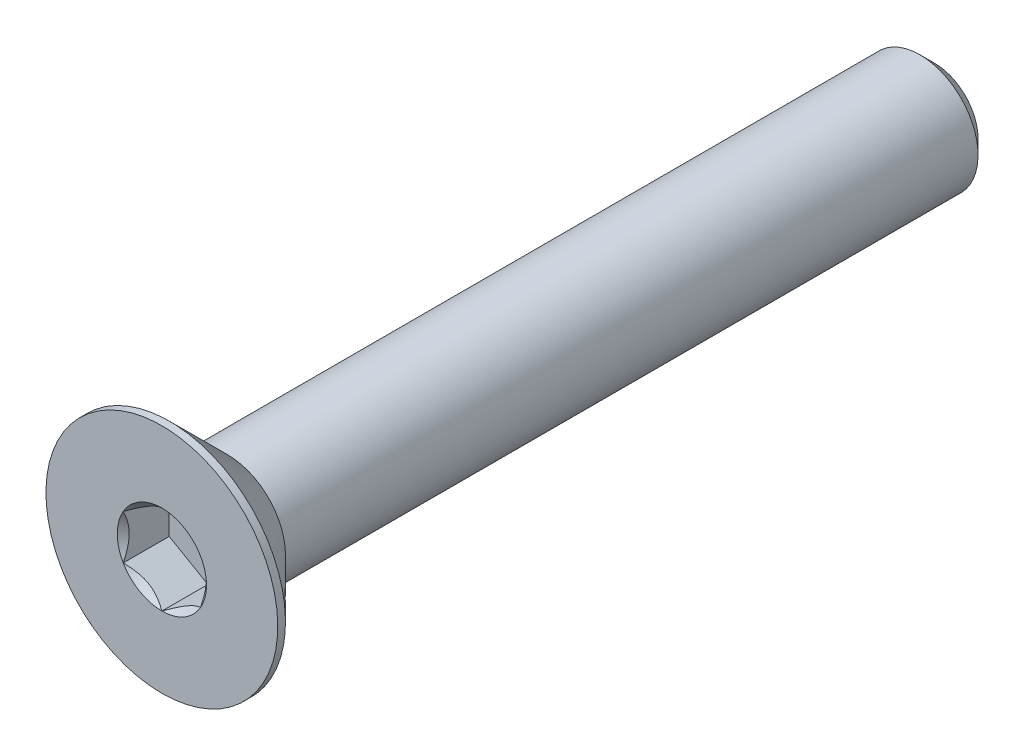
ISO-10303-21;
HEADER;
FILE_DESCRIPTION(('STEP AP214'),'2;1');
FILE_NAME('part.step','',(''),(''),'','','');
FILE_SCHEMA(('AUTOMOTIVE_DESIGN { 1 0 10303 214 1 1 1 1 }'));
ENDSEC;
DATA;
#1=APPLICATION_CONTEXT('core data for automotive mechanical design processes');
#2=APPLICATION_PROTOCOL_DEFINITION('international standard','automotive_design',2000,#1);
#3=PRODUCT_CONTEXT('',#1,'mechanical');
#4=PRODUCT('Part','Part','',(#3));
#5=PRODUCT_RELATED_PRODUCT_CATEGORY('part','',(#4));
#6=PRODUCT_DEFINITION_FORMATION('','',#4);
#7=PRODUCT_DEFINITION_CONTEXT('part definition',#1,'design');
#8=PRODUCT_DEFINITION('design','',#6,#7);
#9=PRODUCT_DEFINITION_SHAPE('','',#8);
#10=(LENGTH_UNIT() NAMED_UNIT(*) SI_UNIT(.MILLI.,.METRE.));
#11=(NAMED_UNIT(*) PLANE_ANGLE_UNIT() SI_UNIT($,.RADIAN.));
#12=(NAMED_UNIT(*) SI_UNIT($,.STERADIAN.) SOLID_ANGLE_UNIT());
#13=UNCERTAINTY_MEASURE_WITH_UNIT(LENGTH_MEASURE(1.E-05),#10,'distance_accuracy_value','');
#14=(GEOMETRIC_REPRESENTATION_CONTEXT(3) GLOBAL_UNCERTAINTY_ASSIGNED_CONTEXT((#13)) GLOBAL_UNIT_ASSIGNED_CONTEXT((#10,
#11,#12)) REPRESENTATION_CONTEXT('',''));
#15=CARTESIAN_POINT('',(0.,0.,0.));
#16=DIRECTION('',(0.,0.,1.));
#17=DIRECTION('',(1.,0.,0.));
#18=AXIS2_PLACEMENT_3D('',#15,#16,#17);
#19=CARTESIAN_POINT('',(0.,0.,-20.));
#20=DIRECTION('',(0.,0.,-1.));
#21=DIRECTION('',(0.,1.,0.));
#22=AXIS2_PLACEMENT_3D('',#19,#20,#21);
#23=CYLINDRICAL_SURFACE('',#22,1.5);
#24=CARTESIAN_POINT('',(0.,0.,-19.625));
#25=DIRECTION('',(0.,0.,-1.));
#26=DIRECTION('',(0.,1.,0.));
#27=AXIS2_PLACEMENT_3D('',#24,#25,#26);
#28=CIRCLE('',#27,1.5);
#29=CARTESIAN_POINT('',(0.,1.5,-19.625));
#30=VERTEX_POINT('',#29);
#31=EDGE_CURVE('E48',#30,#30,#28,.F.);
#32=ORIENTED_EDGE('',*,*,#31,.T.);
#33=EDGE_LOOP('',(#32));
#34=FACE_BOUND('',#33,.T.);
#35=CARTESIAN_POINT('',(0.,0.,-1.7));
#36=DIRECTION('',(0.,0.,1.));
#37=DIRECTION('',(0.,-1.,0.));
#38=AXIS2_PLACEMENT_3D('',#35,#36,#37);
#39=CIRCLE('',#38,1.5);
#40=CARTESIAN_POINT('',(0.,-1.50000000000001,-1.69999999999999));
#41=VERTEX_POINT('',#40);
#42=EDGE_CURVE('E166',#41,#41,#39,.T.);
#43=ORIENTED_EDGE('',*,*,#42,.F.);
#44=EDGE_LOOP('',(#43));
#45=FACE_BOUND('',#44,.T.);
#46=ADVANCED_FACE('F35',(#34,#45),#23,.T.);
#47=CARTESIAN_POINT('',(0.,-1.5,-20.));
#48=DIRECTION('',(0.,0.,-1.));
#49=DIRECTION('',(0.,1.,0.));
#50=AXIS2_PLACEMENT_3D('',#47,#48,#49);
#51=PLANE('',#50);
#52=CARTESIAN_POINT('',(0.,0.,-20.));
#53=DIRECTION('',(0.,0.,-1.));
#54=DIRECTION('',(0.,1.,0.));
#55=AXIS2_PLACEMENT_3D('',#52,#53,#54);
#56=CIRCLE('',#55,1.125);
#57=CARTESIAN_POINT('',(0.,1.125,-20.));
#58=VERTEX_POINT('',#57);
#59=EDGE_CURVE('E175',#58,#58,#56,.T.);
#60=ORIENTED_EDGE('',*,*,#59,.T.);
#61=EDGE_LOOP('',(#60));
#62=FACE_BOUND('',#61,.T.);
#63=ADVANCED_FACE('F185',(#62),#51,.T.);
#64=CARTESIAN_POINT('',(0.,0.,-20.));
#65=DIRECTION('',(0.,0.,1.));
#66=DIRECTION('',(0.,-1.,0.));
#67=AXIS2_PLACEMENT_3D('',#64,#65,#66);
#68=CONICAL_SURFACE('',#67,1.125,0.785398163397446);
#69=ORIENTED_EDGE('',*,*,#31,.F.);
#70=EDGE_LOOP('',(#69));
#71=FACE_BOUND('',#70,.T.);
#72=ORIENTED_EDGE('',*,*,#59,.F.);
#73=EDGE_LOOP('',(#72));
#74=FACE_BOUND('',#73,.T.);
#75=ADVANCED_FACE('F37',(#71,#74),#68,.T.);
#76=CARTESIAN_POINT('',(0.,0.,0.));
#77=DIRECTION('',(0.,0.,1.));
#78=DIRECTION('',(0.,-1.,0.));
#79=AXIS2_PLACEMENT_3D('',#76,#77,#78);
#80=CYLINDRICAL_SURFACE('',#79,3.);
#81=CARTESIAN_POINT('',(0.,0.,0.));
#82=DIRECTION('',(0.,0.,1.));
#83=DIRECTION('',(0.,-1.,0.));
#84=AXIS2_PLACEMENT_3D('',#81,#82,#83);
#85=CIRCLE('',#84,3.);
#86=CARTESIAN_POINT('',(0.,-3.,0.));
#87=VERTEX_POINT('',#86);
#88=EDGE_CURVE('E172',#87,#87,#85,.T.);
#89=ORIENTED_EDGE('',*,*,#88,.F.);
#90=EDGE_LOOP('',(#89));
#91=FACE_BOUND('',#90,.T.);
#92=CARTESIAN_POINT('',(0.,0.,-0.200000000000003));
#93=DIRECTION('',(0.,0.,1.));
#94=DIRECTION('',(0.,-1.,0.));
#95=AXIS2_PLACEMENT_3D('',#92,#93,#94);
#96=CIRCLE('',#95,3.);
#97=CARTESIAN_POINT('',(0.,-3.,-0.199999999999997));
#98=VERTEX_POINT('',#97);
#99=EDGE_CURVE('E169',#98,#98,#96,.T.);
#100=ORIENTED_EDGE('',*,*,#99,.T.);
#101=EDGE_LOOP('',(#100));
#102=FACE_BOUND('',#101,.T.);
#103=ADVANCED_FACE('F184',(#91,#102),#80,.T.);
#104=CARTESIAN_POINT('',(0.,0.,-1.7));
#105=DIRECTION('',(0.,0.,1.));
#106=DIRECTION('',(0.,-1.,0.));
#107=AXIS2_PLACEMENT_3D('',#104,#105,#106);
#108=CONICAL_SURFACE('',#107,1.5,0.785398163397448);
#109=ORIENTED_EDGE('',*,*,#99,.F.);
#110=EDGE_LOOP('',(#109));
#111=FACE_BOUND('',#110,.T.);
#112=ORIENTED_EDGE('',*,*,#42,.T.);
#113=EDGE_LOOP('',(#112));
#114=FACE_BOUND('',#113,.T.);
#115=ADVANCED_FACE('F195',(#111,#114),#108,.T.);
#116=CARTESIAN_POINT('',(0.,-1.5,0.));
#117=DIRECTION('',(0.,0.,1.));
#118=DIRECTION('',(0.,-1.,0.));
#119=AXIS2_PLACEMENT_3D('',#116,#117,#118);
#120=PLANE('',#119);
#121=CARTESIAN_POINT('',(0.,0.,0.));
#122=DIRECTION('',(0.,0.,1.));
#123=DIRECTION('',(1.,0.,0.));
#124=AXIS2_PLACEMENT_3D('',#121,#122,#123);
#125=CIRCLE('',#124,1.15470053837925);
#126=CARTESIAN_POINT('',(0.,-1.15470053837925,0.));
#127=VERTEX_POINT('',#126);
#128=CARTESIAN_POINT('',(1.,-0.577350269189629,0.));
#129=VERTEX_POINT('',#128);
#130=EDGE_CURVE('E94',#127,#129,#125,.T.);
#131=ORIENTED_EDGE('',*,*,#130,.F.);
#132=CARTESIAN_POINT('',(-1.,-0.577350269189625,0.));
#133=VERTEX_POINT('',#132);
#134=EDGE_CURVE('E54',#133,#127,#125,.T.);
#135=ORIENTED_EDGE('',*,*,#134,.F.);
#136=CARTESIAN_POINT('',(-1.,0.577350269189627,0.));
#137=VERTEX_POINT('',#136);
#138=EDGE_CURVE('E136',#137,#133,#125,.T.);
#139=ORIENTED_EDGE('',*,*,#138,.F.);
#140=CARTESIAN_POINT('',(0.,1.15470053837925,0.));
#141=VERTEX_POINT('',#140);
#142=EDGE_CURVE('E61',#141,#137,#125,.T.);
#143=ORIENTED_EDGE('',*,*,#142,.F.);
#144=CARTESIAN_POINT('',(0.999999999999999,0.57735026918963,0.));
#145=VERTEX_POINT('',#144);
#146=EDGE_CURVE('E130',#145,#141,#125,.T.);
#147=ORIENTED_EDGE('',*,*,#146,.F.);
#148=EDGE_CURVE('E102',#129,#145,#125,.T.);
#149=ORIENTED_EDGE('',*,*,#148,.F.);
#150=EDGE_LOOP('',(#131,#135,#139,#143,#147,#149));
#151=FACE_BOUND('',#150,.T.);
#152=ORIENTED_EDGE('',*,*,#88,.T.);
#153=EDGE_LOOP('',(#152));
#154=FACE_BOUND('',#153,.T.);
#155=ADVANCED_FACE('F128',(#151,#154),#120,.T.);
#156=CARTESIAN_POINT('',(0.,0.,0.));
#157=DIRECTION('',(0.,0.,1.));
#158=DIRECTION('',(1.,0.,0.));
#159=AXIS2_PLACEMENT_3D('',#156,#157,#158);
#160=CONICAL_SURFACE('',#159,1.15470053837925,0.78539816339745);
#161=ORIENTED_EDGE('',*,*,#148,.T.);
#162=CARTESIAN_POINT('',(1.,-1.15147208663215,0.37038567764035));
#163=CARTESIAN_POINT('',(1.,-1.12343448004835,0.349219919995329));
#164=CARTESIAN_POINT('',(1.,-1.09524064866509,0.328261692292662));
#165=CARTESIAN_POINT('',(1.,-1.0384771565924,0.286846022342674));
#166=CARTESIAN_POINT('',(1.,-1.00990740397363,0.266388706225875));
#167=CARTESIAN_POINT('',(1.,-0.923120894462775,0.205604795042125));
#168=CARTESIAN_POINT('',(1.,-0.864253173878445,0.166192229039321));
#169=CARTESIAN_POINT('',(1.,-0.740809858355811,0.0888206642581912));
#170=CARTESIAN_POINT('',(1.,-0.676100255223809,0.0510730391621572));
#171=CARTESIAN_POINT('',(1.,-0.543448939110598,-0.0179754124197493));
#172=CARTESIAN_POINT('',(1.,-0.475519112076496,-0.0492979721328732));
#173=CARTESIAN_POINT('',(1.,-0.373555850372648,-0.0876182211023994));
#174=CARTESIAN_POINT('',(1.,-0.341031989714046,-0.0986164083437858));
#175=CARTESIAN_POINT('',(1.,-0.275199079103602,-0.118001657838892));
#176=CARTESIAN_POINT('',(1.,-0.241889975229392,-0.126388540210114));
#177=CARTESIAN_POINT('',(1.,-0.175247517106615,-0.139974779269861));
#178=CARTESIAN_POINT('',(1.,-0.141925568285808,-0.145229209222388));
#179=CARTESIAN_POINT('',(1.,-0.0749144363078012,-0.152451313423326));
#180=CARTESIAN_POINT('',(1.,-0.0412251979295629,-0.154418486386096));
#181=CARTESIAN_POINT('',(1.,0.0249580991768641,-0.15491680160889));
#182=CARTESIAN_POINT('',(0.999999999999999,0.0574512825561956,-0.153569732116433));
#183=CARTESIAN_POINT('',(0.999999999999999,0.122148505605779,-0.147783515512583));
#184=CARTESIAN_POINT('',(0.999999999999999,0.15435261003388,-0.143345079353517));
#185=CARTESIAN_POINT('',(0.999999999999999,0.218799898762754,-0.131543169877152));
#186=CARTESIAN_POINT('',(0.999999999999999,0.251033743161196,-0.124129458987689));
#187=CARTESIAN_POINT('',(0.999999999999999,0.314797132241693,-0.10677105753529));
#188=CARTESIAN_POINT('',(0.999999999999999,0.346326735615183,-0.0968265787490622));
#189=CARTESIAN_POINT('',(0.999999999999999,0.445594187589164,-0.0617765175020632));
#190=CARTESIAN_POINT('',(0.999999999999999,0.511919139313635,-0.0326791417167038));
#191=CARTESIAN_POINT('',(0.999999999999999,0.641453244454049,0.0320153295771436));
#192=CARTESIAN_POINT('',(0.999999999999999,0.70465013290315,0.0676357765869626));
#193=CARTESIAN_POINT('',(0.999999999999999,0.825428489916355,0.141123901182446));
#194=CARTESIAN_POINT('',(0.999999999999999,0.8831329475932,0.178791946953849));
#195=CARTESIAN_POINT('',(0.999999999999999,0.96814885340664,0.237022852735948));
#196=CARTESIAN_POINT('',(0.999999999999999,0.996120570074659,0.256638475547176));
#197=CARTESIAN_POINT('',(0.999999999999999,1.05168177697804,0.29638851682867));
#198=CARTESIAN_POINT('',(0.999999999999999,1.07927136964837,0.316522791957775));
#199=CARTESIAN_POINT('',(0.999999999999999,1.10670185312703,0.33687211882347));
#200=B_SPLINE_CURVE_WITH_KNOTS('',3,(#162,#163,#164,#165,#166,#167,#168,#169,#170,#171,#172,
#173,#174,#175,#176,#177,#178,#179,#180,#181,#182,#183,#184,#185,#186,#187,#188,#189,#190,#191,
#192,#193,#194,#195,#196,#197,#198,#199),.UNSPECIFIED.,.F.,.F.,(4,2,2,2,2,2,2,2,2,2,2,2,2,2,2,2,
2,2,4),(0.,0.10538645910335,0.210799187370249,0.423233611646473,0.647793541035351,
0.871580877910865,0.974493074342054,1.07741235842104,1.17846428216995,1.2795316142844,
1.37694086751269,1.47432772596047,1.57343322813835,1.67253043981296,1.88917353997386,
2.10660791031433,2.31323734235672,2.41572589214523,2.51818641455632),.UNSPECIFIED.);
#201=EDGE_CURVE('E11',#129,#145,#200,.T.);
#202=ORIENTED_EDGE('',*,*,#201,.F.);
#203=EDGE_LOOP('',(#161,#202));
#204=FACE_BOUND('',#203,.T.);
#205=ADVANCED_FACE('F106',(#204),#160,.F.);
#206=ORIENTED_EDGE('',*,*,#146,.T.);
#207=CARTESIAN_POINT('',(1.0002,0.57723479913579,0.000115487372612922));
#208=CARTESIAN_POINT('',(0.965817404992819,0.597085599618623,-0.0197220691742681));
#209=CARTESIAN_POINT('',(0.930859881860175,0.617268335009458,-0.0383949793611121));
#210=CARTESIAN_POINT('',(0.85957719704391,0.658423412276687,-0.0725852572768427));
#211=CARTESIAN_POINT('',(0.823245249471016,0.679399671988081,-0.0880835909765419));
#212=CARTESIAN_POINT('',(0.749983386196689,0.721697428470848,-0.114632692857735));
#213=CARTESIAN_POINT('',(0.713072148554586,0.743008141459638,-0.125750226003074));
#214=CARTESIAN_POINT('',(0.638437270689141,0.786098608286187,-0.142880134223819));
#215=CARTESIAN_POINT('',(0.600715911891365,0.807877044942282,-0.148905302533328));
#216=CARTESIAN_POINT('',(0.535707801582067,0.845409494928864,-0.154339445032506));
#217=CARTESIAN_POINT('',(0.508505628471829,0.861114676896603,-0.155143061683268));
#218=CARTESIAN_POINT('',(0.454153959330889,0.89249462770603,-0.153793300583113));
#219=CARTESIAN_POINT('',(0.427004476245125,0.908169389073955,-0.151639270452801));
#220=CARTESIAN_POINT('',(0.34594372267304,0.954969836969512,-0.140883027871529));
#221=CARTESIAN_POINT('',(0.292435859021573,0.985862616452448,-0.127985443584644));
#222=CARTESIAN_POINT('',(0.198523934856569,1.04008269114923,-0.0968592693978228));
#223=CARTESIAN_POINT('',(0.157679476328166,1.06366425027551,-0.0802622022981607));
#224=CARTESIAN_POINT('',(0.0775903626180566,1.1099037216352,-0.0428750753147074));
#225=CARTESIAN_POINT('',(0.0383409891295625,1.1325643579843,-0.0220986581825969));
#226=CARTESIAN_POINT('',(-0.00019999999999968,1.15481600843309,0.000115487372613852));
#227=B_SPLINE_CURVE_WITH_KNOTS('',3,(#207,#208,#209,#210,#211,#212,#213,#214,#215,#216,#217,
#218,#219,#220,#221,#222,#223,#224,#225,#226),.UNSPECIFIED.,.F.,.F.,(4,2,2,2,2,2,2,2,2,4),(0.,
0.133237676828559,0.267252229834489,0.399137076269299,0.530689603280766,0.624814864263845,
0.718960890149132,0.907306626112096,1.05710100361789,1.20641411519286),.UNSPECIFIED.);
#228=EDGE_CURVE('E132',#145,#141,#227,.T.);
#229=ORIENTED_EDGE('',*,*,#228,.F.);
#230=EDGE_LOOP('',(#206,#229));
#231=FACE_BOUND('',#230,.T.);
#232=ADVANCED_FACE('F271',(#231),#160,.F.);
#233=ORIENTED_EDGE('',*,*,#142,.T.);
#234=CARTESIAN_POINT('',(0.000200000000000191,1.15481600843309,0.000115487372613877));
#235=CARTESIAN_POINT('',(-0.0341825950071806,1.13496520795026,-0.0197220691742671));
#236=CARTESIAN_POINT('',(-0.0691401181398247,1.11478247255942,-0.0383949793611112));
#237=CARTESIAN_POINT('',(-0.140422802956089,1.07362739529219,-0.0725852572768423));
#238=CARTESIAN_POINT('',(-0.176754750528984,1.0526511355808,-0.0880835909765416));
#239=CARTESIAN_POINT('',(-0.250016613803311,1.01035337909803,-0.114632692857735));
#240=CARTESIAN_POINT('',(-0.286927851445414,0.989042666109242,-0.125750226003074));
#241=CARTESIAN_POINT('',(-0.361562729310859,0.945952199282692,-0.142880134223818));
#242=CARTESIAN_POINT('',(-0.399284088108636,0.924173762626598,-0.148905302533328));
#243=CARTESIAN_POINT('',(-0.464292198417934,0.886641312640016,-0.154339445032507));
#244=CARTESIAN_POINT('',(-0.491494371528172,0.870936130672277,-0.155143061683268));
#245=CARTESIAN_POINT('',(-0.545846040669112,0.83955617986285,-0.153793300583113));
#246=CARTESIAN_POINT('',(-0.572995523754876,0.823881418494925,-0.151639270452801));
#247=CARTESIAN_POINT('',(-0.654056277326961,0.777080970599368,-0.140883027871529));
#248=CARTESIAN_POINT('',(-0.707564140978428,0.746188191116431,-0.127985443584644));
#249=CARTESIAN_POINT('',(-0.801476065143432,0.691968116419651,-0.0968592693978229));
#250=CARTESIAN_POINT('',(-0.842320523671835,0.668386557293373,-0.0802622022981608));
#251=CARTESIAN_POINT('',(-0.922409637381944,0.622147085933683,-0.0428750753147074));
#252=CARTESIAN_POINT('',(-0.961659010870438,0.599486449584577,-0.0220986581825969));
#253=CARTESIAN_POINT('',(-1.0002,0.577234799135789,0.0001154873726139));
#254=B_SPLINE_CURVE_WITH_KNOTS('',3,(#234,#235,#236,#237,#238,#239,#240,#241,#242,#243,#244,
#245,#246,#247,#248,#249,#250,#251,#252,#253),.UNSPECIFIED.,.F.,.F.,(4,2,2,2,2,2,2,2,2,4),(0.,
0.133237676828559,0.26725222983449,0.3991370762693,0.530689603280769,0.624814864263847,
0.718960890149134,0.907306626112098,1.05710100361789,1.20641411519286),.UNSPECIFIED.);
#255=EDGE_CURVE('E135',#141,#137,#254,.T.);
#256=ORIENTED_EDGE('',*,*,#255,.F.);
#257=EDGE_LOOP('',(#233,#256));
#258=FACE_BOUND('',#257,.T.);
#259=ADVANCED_FACE('F267',(#258),#160,.F.);
#260=ORIENTED_EDGE('',*,*,#138,.T.);
#261=CARTESIAN_POINT('',(-1.,-1.15147208646462,0.370385677513859));
#262=CARTESIAN_POINT('',(-1.,-1.12343447988552,0.349219919873709));
#263=CARTESIAN_POINT('',(-1.,-1.09524064850697,0.328261692175907));
#264=CARTESIAN_POINT('',(-1.,-1.03847715644376,0.286846022235619));
#265=CARTESIAN_POINT('',(-1.,-1.00990740382975,0.266388706123656));
#266=CARTESIAN_POINT('',(-1.,-0.923120894333475,0.205604794954507));
#267=CARTESIAN_POINT('',(-1.,-0.864253173759058,0.166192228961395));
#268=CARTESIAN_POINT('',(-1.,-0.740809858258044,0.0888206642002029));
#269=CARTESIAN_POINT('',(-1.,-0.676100255137806,0.0510730391143402));
#270=CARTESIAN_POINT('',(-1.,-0.543448939049123,-0.0179754124487101));
#271=CARTESIAN_POINT('',(-1.,-0.475519112027778,-0.0492979721531364));
#272=CARTESIAN_POINT('',(-1.,-0.373555850333528,-0.0876182211162067));
#273=CARTESIAN_POINT('',(-1.,-0.341031989670907,-0.0986164083578452));
#274=CARTESIAN_POINT('',(-1.,-0.275199079052293,-0.118001657852641));
#275=CARTESIAN_POINT('',(-1.,-0.241889975173932,-0.126388540223302));
#276=CARTESIAN_POINT('',(-1.,-0.175247517042992,-0.139974779280985));
#277=CARTESIAN_POINT('',(-1.,-0.141925568218174,-0.145229209232034));
#278=CARTESIAN_POINT('',(-1.,-0.0749144362322783,-0.152451313429109));
#279=CARTESIAN_POINT('',(-1.,-0.041225197850161,-0.154418486389494));
#280=CARTESIAN_POINT('',(-1.,0.0249580992634217,-0.15491680160684));
#281=CARTESIAN_POINT('',(-1.,0.05745128264604,-0.153569732111367));
#282=CARTESIAN_POINT('',(-1.,0.122148505701867,-0.147783515501017));
#283=CARTESIAN_POINT('',(-1.,0.154352610132927,-0.143345079338466));
#284=CARTESIAN_POINT('',(-1.,0.21879989886764,-0.131543169854797));
#285=CARTESIAN_POINT('',(-1.,0.251033743268954,-0.124129458961492));
#286=CARTESIAN_POINT('',(-1.,0.314797132354919,-0.106771057501326));
#287=CARTESIAN_POINT('',(-1.,0.346326735731005,-0.0968265787111716));
#288=CARTESIAN_POINT('',(-1.,0.445594187730205,-0.0617765174456647));
#289=CARTESIAN_POINT('',(-1.,0.511919139476037,-0.0326791416432769));
#290=CARTESIAN_POINT('',(-1.,0.641453244657533,0.0320153296865035));
#291=CARTESIAN_POINT('',(-1.,0.704650133126345,0.0676357767152405));
#292=CARTESIAN_POINT('',(-1.,0.825428490174987,0.141123901346934));
#293=CARTESIAN_POINT('',(-1.,0.883132947867686,0.178791947135462));
#294=CARTESIAN_POINT('',(-1.,0.968148853704566,0.237022852943162));
#295=CARTESIAN_POINT('',(-1.,0.996120570380286,0.256638475762855));
#296=CARTESIAN_POINT('',(-1.,1.05168177729902,0.29638851706127));
#297=CARTESIAN_POINT('',(-1.,1.079271369977,0.316522792198831));
#298=CARTESIAN_POINT('',(-1.,1.10670185346329,0.336872119072971));
#299=B_SPLINE_CURVE_WITH_KNOTS('',3,(#261,#262,#263,#264,#265,#266,#267,#268,#269,#270,#271,
#272,#273,#274,#275,#276,#277,#278,#279,#280,#281,#282,#283,#284,#285,#286,#287,#288,#289,#290,
#291,#292,#293,#294,#295,#296,#297,#298),.UNSPECIFIED.,.F.,.F.,(4,2,2,2,2,2,2,2,2,2,2,2,2,2,2,2,
2,2,4),(0.,0.105386459083291,0.210799187330124,0.423233611565469,0.647793540908503,
0.871580877738609,0.97449307418142,1.07741235827201,1.17846428203205,1.27953161415762,
1.3769408673961,1.47432772585408,1.57343322804293,1.67253043972851,1.88917353996827,
2.10660791038813,2.31323734249843,2.41572589232044,2.51818641476503),.UNSPECIFIED.);
#300=EDGE_CURVE('E142',#137,#133,#299,.F.);
#301=ORIENTED_EDGE('',*,*,#300,.F.);
#302=EDGE_LOOP('',(#260,#301));
#303=FACE_BOUND('',#302,.T.);
#304=ADVANCED_FACE('F140',(#303),#160,.F.);
#305=ORIENTED_EDGE('',*,*,#134,.T.);
#306=CARTESIAN_POINT('',(-1.0002,-0.577234799135787,0.000115487372612489));
#307=CARTESIAN_POINT('',(-0.96581740499282,-0.59708559961862,-0.0197220691742688));
#308=CARTESIAN_POINT('',(-0.930859881860176,-0.617268335009455,-0.038394979361113));
#309=CARTESIAN_POINT('',(-0.859577197043911,-0.658423412276685,-0.0725852572768439));
#310=CARTESIAN_POINT('',(-0.823245249471016,-0.679399671988079,-0.0880835909765431));
#311=CARTESIAN_POINT('',(-0.749983386196689,-0.721697428470846,-0.114632692857737));
#312=CARTESIAN_POINT('',(-0.713072148554586,-0.743008141459636,-0.125750226003076));
#313=CARTESIAN_POINT('',(-0.638437270689141,-0.786098608286186,-0.14288013422382));
#314=CARTESIAN_POINT('',(-0.600715911891364,-0.80787704494228,-0.148905302533329));
#315=CARTESIAN_POINT('',(-0.535707801582066,-0.845409494928862,-0.154339445032508));
#316=CARTESIAN_POINT('',(-0.508505628471828,-0.861114676896601,-0.15514306168327));
#317=CARTESIAN_POINT('',(-0.454153959330888,-0.892494627706028,-0.153793300583115));
#318=CARTESIAN_POINT('',(-0.427004476245124,-0.908169389073953,-0.151639270452802));
#319=CARTESIAN_POINT('',(-0.34594372267304,-0.95496983696951,-0.140883027871531));
#320=CARTESIAN_POINT('',(-0.292435859021573,-0.985862616452447,-0.127985443584646));
#321=CARTESIAN_POINT('',(-0.198523934856568,-1.04008269114923,-0.0968592693978246));
#322=CARTESIAN_POINT('',(-0.157679476328166,-1.06366425027551,-0.0802622022981625));
#323=CARTESIAN_POINT('',(-0.0775903626180562,-1.1099037216352,-0.042875075314709));
#324=CARTESIAN_POINT('',(-0.0383409891295622,-1.1325643579843,-0.0220986581825985));
#325=CARTESIAN_POINT('',(0.000199999999999913,-1.15481600843309,0.000115487372612217));
#326=B_SPLINE_CURVE_WITH_KNOTS('',3,(#306,#307,#308,#309,#310,#311,#312,#313,#314,#315,#316,
#317,#318,#319,#320,#321,#322,#323,#324,#325),.UNSPECIFIED.,.F.,.F.,(4,2,2,2,2,2,2,2,2,4),(0.,
0.133237676828559,0.267252229834491,0.399137076269301,0.530689603280769,0.624814864263847,
0.718960890149134,0.907306626112098,1.0571010036179,1.20641411519286),.UNSPECIFIED.);
#327=EDGE_CURVE('E118',#133,#127,#326,.T.);
#328=ORIENTED_EDGE('',*,*,#327,.F.);
#329=EDGE_LOOP('',(#305,#328));
#330=FACE_BOUND('',#329,.T.);
#331=ADVANCED_FACE('F222',(#330),#160,.F.);
#332=ORIENTED_EDGE('',*,*,#130,.T.);
#333=CARTESIAN_POINT('',(-0.000200000000000056,-1.15481600843309,0.000115487372612143));
#334=CARTESIAN_POINT('',(0.0341825950071805,-1.13496520795026,-0.0197220691742688));
#335=CARTESIAN_POINT('',(0.0691401181398247,-1.11478247255942,-0.038394979361113));
#336=CARTESIAN_POINT('',(0.140422802956089,-1.07362739529219,-0.072585257276844));
#337=CARTESIAN_POINT('',(0.176754750528984,-1.0526511355808,-0.0880835909765433));
#338=CARTESIAN_POINT('',(0.250016613803311,-1.01035337909803,-0.114632692857737));
#339=CARTESIAN_POINT('',(0.286927851445414,-0.98904266610924,-0.125750226003076));
#340=CARTESIAN_POINT('',(0.361562729310859,-0.945952199282691,-0.14288013422382));
#341=CARTESIAN_POINT('',(0.399284088108636,-0.924173762626596,-0.148905302533329));
#342=CARTESIAN_POINT('',(0.464292198417933,-0.886641312640014,-0.154339445032508));
#343=CARTESIAN_POINT('',(0.491494371528172,-0.870936130672275,-0.15514306168327));
#344=CARTESIAN_POINT('',(0.545846040669112,-0.839556179862848,-0.153793300583115));
#345=CARTESIAN_POINT('',(0.572995523754876,-0.823881418494923,-0.151639270452802));
#346=CARTESIAN_POINT('',(0.65405627732696,-0.777080970599366,-0.140883027871531));
#347=CARTESIAN_POINT('',(0.707564140978427,-0.74618819111643,-0.127985443584646));
#348=CARTESIAN_POINT('',(0.801476065143431,-0.691968116419649,-0.0968592693978246));
#349=CARTESIAN_POINT('',(0.842320523671834,-0.668386557293371,-0.0802622022981624));
#350=CARTESIAN_POINT('',(0.922409637381943,-0.622147085933681,-0.042875075314709));
#351=CARTESIAN_POINT('',(0.961659010870437,-0.599486449584575,-0.0220986581825985));
#352=CARTESIAN_POINT('',(1.0002,-0.577234799135788,0.000115487372612027));
#353=B_SPLINE_CURVE_WITH_KNOTS('',3,(#333,#334,#335,#336,#337,#338,#339,#340,#341,#342,#343,
#344,#345,#346,#347,#348,#349,#350,#351,#352),.UNSPECIFIED.,.F.,.F.,(4,2,2,2,2,2,2,2,2,4),(0.,
0.133237676828559,0.26725222983449,0.3991370762693,0.530689603280768,0.624814864263846,
0.718960890149133,0.907306626112097,1.05710100361789,1.20641411519286),.UNSPECIFIED.);
#354=EDGE_CURVE('E98',#127,#129,#353,.T.);
#355=ORIENTED_EDGE('',*,*,#354,.F.);
#356=EDGE_LOOP('',(#332,#355));
#357=FACE_BOUND('',#356,.T.);
#358=ADVANCED_FACE('F96',(#357),#160,.F.);
#359=CARTESIAN_POINT('',(1.,-0.577350269189626,-1.19));
#360=DIRECTION('',(0.,0.,1.));
#361=DIRECTION('',(1.,0.,0.));
#362=AXIS2_PLACEMENT_3D('',#359,#360,#361);
#363=PLANE('',#362);
#364=DIRECTION('',(0.866025403784439,0.5,0.));
#365=VECTOR('',#364,1.);
#366=CARTESIAN_POINT('',(0.,-1.15470053837925,-1.19));
#367=LINE('',#366,#365);
#368=CARTESIAN_POINT('',(0.,-1.15470053837925,-1.19));
#369=VERTEX_POINT('',#368);
#370=CARTESIAN_POINT('',(1.,-0.577350269189626,-1.19));
#371=VERTEX_POINT('',#370);
#372=EDGE_CURVE('E117',#369,#371,#367,.T.);
#373=ORIENTED_EDGE('',*,*,#372,.T.);
#374=DIRECTION('',(0.,1.,0.));
#375=VECTOR('',#374,1.);
#376=CARTESIAN_POINT('',(1.,-0.577350269189626,-1.19));
#377=LINE('',#376,#375);
#378=CARTESIAN_POINT('',(0.999999999999999,0.577350269189628,-1.19));
#379=VERTEX_POINT('',#378);
#380=EDGE_CURVE('E122',#371,#379,#377,.T.);
#381=ORIENTED_EDGE('',*,*,#380,.T.);
#382=DIRECTION('',(-0.866025403784439,0.5,0.));
#383=VECTOR('',#382,1.);
#384=CARTESIAN_POINT('',(0.999999999999999,0.577350269189628,-1.19));
#385=LINE('',#384,#383);
#386=CARTESIAN_POINT('',(0.,1.15470053837925,-1.19));
#387=VERTEX_POINT('',#386);
#388=EDGE_CURVE('E253',#379,#387,#385,.T.);
#389=ORIENTED_EDGE('',*,*,#388,.T.);
#390=DIRECTION('',(-0.866025403784439,-0.5,0.));
#391=VECTOR('',#390,1.);
#392=CARTESIAN_POINT('',(0.,1.15470053837925,-1.19));
#393=LINE('',#392,#391);
#394=CARTESIAN_POINT('',(-1.,0.577350269189627,-1.19));
#395=VERTEX_POINT('',#394);
#396=EDGE_CURVE('E255',#387,#395,#393,.T.);
#397=ORIENTED_EDGE('',*,*,#396,.T.);
#398=DIRECTION('',(0.,-1.,0.));
#399=VECTOR('',#398,1.);
#400=CARTESIAN_POINT('',(-1.,0.577350269189627,-1.19));
#401=LINE('',#400,#399);
#402=CARTESIAN_POINT('',(-1.,-0.577350269189625,-1.19));
#403=VERTEX_POINT('',#402);
#404=EDGE_CURVE('E157',#395,#403,#401,.T.);
#405=ORIENTED_EDGE('',*,*,#404,.T.);
#406=DIRECTION('',(0.866025403784438,-0.5,0.));
#407=VECTOR('',#406,1.);
#408=CARTESIAN_POINT('',(-1.,-0.577350269189625,-1.19));
#409=LINE('',#408,#407);
#410=EDGE_CURVE('E125',#403,#369,#409,.T.);
#411=ORIENTED_EDGE('',*,*,#410,.T.);
#412=EDGE_LOOP('',(#373,#381,#389,#397,#405,#411));
#413=FACE_BOUND('',#412,.T.);
#414=ADVANCED_FACE('F221',(#413),#363,.T.);
#415=CARTESIAN_POINT('',(1.,-0.577350269189626,-1.19));
#416=DIRECTION('',(1.,0.,0.));
#417=DIRECTION('',(0.,1.,0.));
#418=AXIS2_PLACEMENT_3D('',#415,#416,#417);
#419=PLANE('',#418);
#420=DIRECTION('',(0.,0.,1.));
#421=VECTOR('',#420,1.);
#422=CARTESIAN_POINT('',(1.,-0.577350269189626,-1.19));
#423=LINE('',#422,#421);
#424=EDGE_CURVE('E114',#371,#129,#423,.T.);
#425=ORIENTED_EDGE('',*,*,#424,.T.);
#426=ORIENTED_EDGE('',*,*,#201,.T.);
#427=DIRECTION('',(0.,0.,1.));
#428=VECTOR('',#427,1.);
#429=CARTESIAN_POINT('',(0.999999999999999,0.577350269189628,-1.19));
#430=LINE('',#429,#428);
#431=EDGE_CURVE('E124',#379,#145,#430,.T.);
#432=ORIENTED_EDGE('',*,*,#431,.F.);
#433=ORIENTED_EDGE('',*,*,#380,.F.);
#434=EDGE_LOOP('',(#425,#426,#432,#433));
#435=FACE_BOUND('',#434,.T.);
#436=ADVANCED_FACE('F120',(#435),#419,.F.);
#437=CARTESIAN_POINT('',(0.999999999999999,0.577350269189628,-1.19));
#438=DIRECTION('',(0.5,0.866025403784439,0.));
#439=DIRECTION('',(-0.866025403784439,0.5,0.));
#440=AXIS2_PLACEMENT_3D('',#437,#438,#439);
#441=PLANE('',#440);
#442=ORIENTED_EDGE('',*,*,#431,.T.);
#443=ORIENTED_EDGE('',*,*,#228,.T.);
#444=DIRECTION('',(0.,0.,1.));
#445=VECTOR('',#444,1.);
#446=CARTESIAN_POINT('',(0.,1.15470053837925,-1.19));
#447=LINE('',#446,#445);
#448=EDGE_CURVE('E153',#387,#141,#447,.T.);
#449=ORIENTED_EDGE('',*,*,#448,.F.);
#450=ORIENTED_EDGE('',*,*,#388,.F.);
#451=EDGE_LOOP('',(#442,#443,#449,#450));
#452=FACE_BOUND('',#451,.T.);
#453=ADVANCED_FACE('F244',(#452),#441,.F.);
#454=CARTESIAN_POINT('',(0.,1.15470053837925,-1.19));
#455=DIRECTION('',(-0.5,0.866025403784439,0.));
#456=DIRECTION('',(-0.866025403784439,-0.5,0.));
#457=AXIS2_PLACEMENT_3D('',#454,#455,#456);
#458=PLANE('',#457);
#459=ORIENTED_EDGE('',*,*,#448,.T.);
#460=ORIENTED_EDGE('',*,*,#255,.T.);
#461=DIRECTION('',(0.,0.,1.));
#462=VECTOR('',#461,1.);
#463=CARTESIAN_POINT('',(-1.,0.577350269189627,-1.19));
#464=LINE('',#463,#462);
#465=EDGE_CURVE('E151',#395,#137,#464,.T.);
#466=ORIENTED_EDGE('',*,*,#465,.F.);
#467=ORIENTED_EDGE('',*,*,#396,.F.);
#468=EDGE_LOOP('',(#459,#460,#466,#467));
#469=FACE_BOUND('',#468,.T.);
#470=ADVANCED_FACE('F149',(#469),#458,.F.);
#471=CARTESIAN_POINT('',(-1.,0.577350269189627,-1.19));
#472=DIRECTION('',(-1.,0.,0.));
#473=DIRECTION('',(0.,0.,1.));
#474=AXIS2_PLACEMENT_3D('',#471,#472,#473);
#475=PLANE('',#474);
#476=ORIENTED_EDGE('',*,*,#465,.T.);
#477=ORIENTED_EDGE('',*,*,#300,.T.);
#478=DIRECTION('',(0.,0.,1.));
#479=VECTOR('',#478,1.);
#480=CARTESIAN_POINT('',(-1.,-0.577350269189625,-1.19));
#481=LINE('',#480,#479);
#482=EDGE_CURVE('E159',#403,#133,#481,.T.);
#483=ORIENTED_EDGE('',*,*,#482,.F.);
#484=ORIENTED_EDGE('',*,*,#404,.F.);
#485=EDGE_LOOP('',(#476,#477,#483,#484));
#486=FACE_BOUND('',#485,.T.);
#487=ADVANCED_FACE('F155',(#486),#475,.F.);
#488=CARTESIAN_POINT('',(-1.,-0.577350269189625,-1.19));
#489=DIRECTION('',(-0.5,-0.866025403784438,0.));
#490=DIRECTION('',(0.866025403784438,-0.5,0.));
#491=AXIS2_PLACEMENT_3D('',#488,#489,#490);
#492=PLANE('',#491);
#493=ORIENTED_EDGE('',*,*,#482,.T.);
#494=ORIENTED_EDGE('',*,*,#327,.T.);
#495=DIRECTION('',(0.,0.,1.));
#496=VECTOR('',#495,1.);
#497=CARTESIAN_POINT('',(0.,-1.15470053837925,-1.19));
#498=LINE('',#497,#496);
#499=EDGE_CURVE('E116',#369,#127,#498,.T.);
#500=ORIENTED_EDGE('',*,*,#499,.F.);
#501=ORIENTED_EDGE('',*,*,#410,.F.);
#502=EDGE_LOOP('',(#493,#494,#500,#501));
#503=FACE_BOUND('',#502,.T.);
#504=ADVANCED_FACE('F205',(#503),#492,.F.);
#505=CARTESIAN_POINT('',(0.,-1.15470053837925,-1.19));
#506=DIRECTION('',(0.5,-0.866025403784439,0.));
#507=DIRECTION('',(0.866025403784439,0.5,0.));
#508=AXIS2_PLACEMENT_3D('',#505,#506,#507);
#509=PLANE('',#508);
#510=ORIENTED_EDGE('',*,*,#499,.T.);
#511=ORIENTED_EDGE('',*,*,#354,.T.);
#512=ORIENTED_EDGE('',*,*,#424,.F.);
#513=ORIENTED_EDGE('',*,*,#372,.F.);
#514=EDGE_LOOP('',(#510,#511,#512,#513));
#515=FACE_BOUND('',#514,.T.);
#516=ADVANCED_FACE('F112',(#515),#509,.F.);
#517=CLOSED_SHELL('',(#46,#63,#75,#103,#115,#155,#205,#232,#259,#304,#331,#358,#414,#436,#453,
#470,#487,#504,#516));
#518=MANIFOLD_SOLID_BREP('B2',#517);
#519=ADVANCED_BREP_SHAPE_REPRESENTATION('',(#18,#518),#14);
#520=SHAPE_DEFINITION_REPRESENTATION(#9,#519);
ENDSEC;
END-ISO-10303-21;
